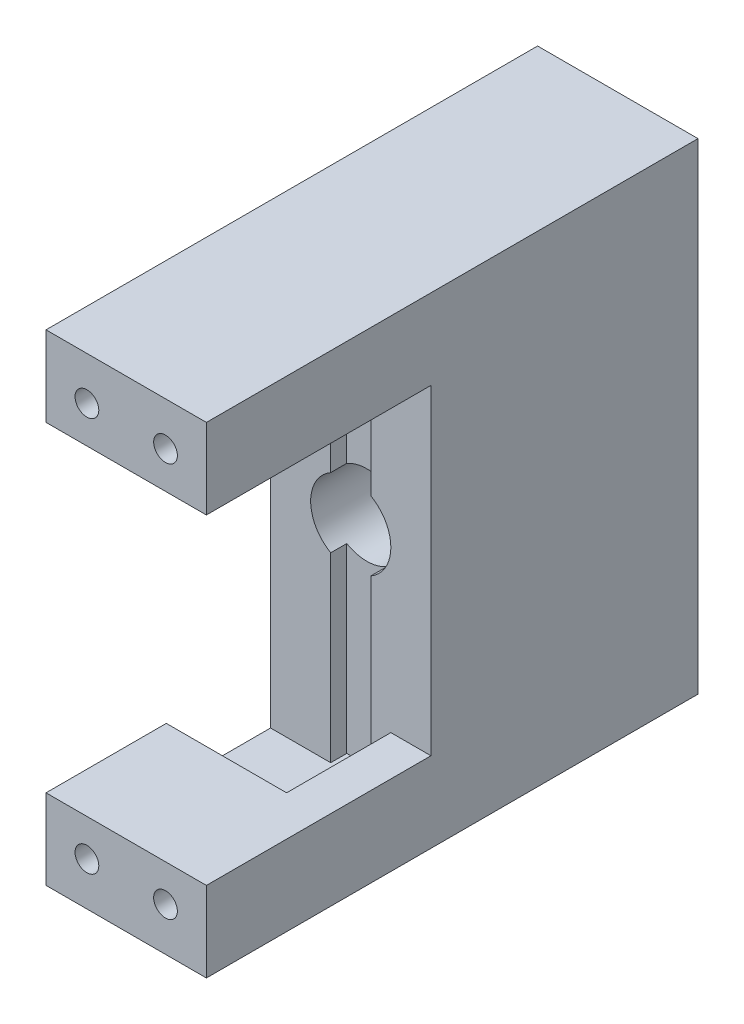
ISO-10303-21;
HEADER;
FILE_DESCRIPTION(('STEP AP214'),'2;1');
FILE_NAME('part.step','',(''),(''),'','','');
FILE_SCHEMA(('AUTOMOTIVE_DESIGN { 1 0 10303 214 1 1 1 1 }'));
ENDSEC;
DATA;
#1=APPLICATION_CONTEXT('core data for automotive mechanical design processes');
#2=APPLICATION_PROTOCOL_DEFINITION('international standard','automotive_design',2000,#1);
#3=PRODUCT_CONTEXT('',#1,'mechanical');
#4=PRODUCT('Part','Part','',(#3));
#5=PRODUCT_RELATED_PRODUCT_CATEGORY('part','',(#4));
#6=PRODUCT_DEFINITION_FORMATION('','',#4);
#7=PRODUCT_DEFINITION_CONTEXT('part definition',#1,'design');
#8=PRODUCT_DEFINITION('design','',#6,#7);
#9=PRODUCT_DEFINITION_SHAPE('','',#8);
#10=(LENGTH_UNIT() NAMED_UNIT(*) SI_UNIT(.MILLI.,.METRE.));
#11=(NAMED_UNIT(*) PLANE_ANGLE_UNIT() SI_UNIT($,.RADIAN.));
#12=(NAMED_UNIT(*) SI_UNIT($,.STERADIAN.) SOLID_ANGLE_UNIT());
#13=UNCERTAINTY_MEASURE_WITH_UNIT(LENGTH_MEASURE(1.E-05),#10,'distance_accuracy_value','');
#14=(GEOMETRIC_REPRESENTATION_CONTEXT(3) GLOBAL_UNCERTAINTY_ASSIGNED_CONTEXT((#13)) GLOBAL_UNIT_ASSIGNED_CONTEXT((#10,
#11,#12)) REPRESENTATION_CONTEXT('',''));
#15=CARTESIAN_POINT('',(0.,0.,0.));
#16=DIRECTION('',(0.,0.,1.));
#17=DIRECTION('',(1.,0.,0.));
#18=AXIS2_PLACEMENT_3D('',#15,#16,#17);
#19=CARTESIAN_POINT('',(0.,30.,0.));
#20=DIRECTION('',(0.,-1.,0.));
#21=DIRECTION('',(0.,0.,-1.));
#22=AXIS2_PLACEMENT_3D('',#19,#20,#21);
#23=PLANE('',#22);
#24=DIRECTION('',(-1.,0.,0.));
#25=VECTOR('',#24,1.);
#26=CARTESIAN_POINT('',(9.99999999999999,30.,-22.3));
#27=LINE('',#26,#25);
#28=CARTESIAN_POINT('',(9.99999999999999,30.,-22.3));
#29=VERTEX_POINT('',#28);
#30=CARTESIAN_POINT('',(-10.,30.,-22.3));
#31=VERTEX_POINT('',#30);
#32=EDGE_CURVE('E515',#29,#31,#27,.T.);
#33=ORIENTED_EDGE('',*,*,#32,.T.);
#34=DIRECTION('',(0.,0.,1.));
#35=VECTOR('',#34,1.);
#36=CARTESIAN_POINT('',(-10.,30.,14.));
#37=LINE('',#36,#35);
#38=CARTESIAN_POINT('',(-10.,30.,39.));
#39=VERTEX_POINT('',#38);
#40=EDGE_CURVE('E621',#31,#39,#37,.T.);
#41=ORIENTED_EDGE('',*,*,#40,.T.);
#42=DIRECTION('',(-1.,0.,0.));
#43=VECTOR('',#42,1.);
#44=CARTESIAN_POINT('',(-10.,30.,39.));
#45=LINE('',#44,#43);
#46=CARTESIAN_POINT('',(10.,30.,39.));
#47=VERTEX_POINT('',#46);
#48=EDGE_CURVE('E591',#47,#39,#45,.T.);
#49=ORIENTED_EDGE('',*,*,#48,.F.);
#50=DIRECTION('',(0.,0.,-1.));
#51=VECTOR('',#50,1.);
#52=CARTESIAN_POINT('',(9.99999999999999,30.,14.));
#53=LINE('',#52,#51);
#54=EDGE_CURVE('E623',#47,#29,#53,.T.);
#55=ORIENTED_EDGE('',*,*,#54,.T.);
#56=EDGE_LOOP('',(#33,#41,#49,#55));
#57=FACE_BOUND('',#56,.T.);
#58=ADVANCED_FACE('F151',(#57),#23,.F.);
#59=CARTESIAN_POINT('',(-10.,20.,32.));
#60=DIRECTION('',(0.,1.,0.));
#61=DIRECTION('',(0.,0.,1.));
#62=AXIS2_PLACEMENT_3D('',#59,#60,#61);
#63=PLANE('',#62);
#64=DIRECTION('',(-1.,0.,0.));
#65=VECTOR('',#64,1.);
#66=CARTESIAN_POINT('',(0.,20.,-22.3));
#67=LINE('',#66,#65);
#68=CARTESIAN_POINT('',(2.5,20.,-22.3));
#69=VERTEX_POINT('',#68);
#70=CARTESIAN_POINT('',(-2.5,20.,-22.3));
#71=VERTEX_POINT('',#70);
#72=EDGE_CURVE('E393',#69,#71,#67,.T.);
#73=ORIENTED_EDGE('',*,*,#72,.F.);
#74=DIRECTION('',(0.,0.,1.));
#75=VECTOR('',#74,1.);
#76=CARTESIAN_POINT('',(2.5,20.,9.));
#77=LINE('',#76,#75);
#78=CARTESIAN_POINT('',(2.5,20.,11.));
#79=VERTEX_POINT('',#78);
#80=EDGE_CURVE('E420',#69,#79,#77,.T.);
#81=ORIENTED_EDGE('',*,*,#80,.T.);
#82=DIRECTION('',(1.,0.,0.));
#83=VECTOR('',#82,1.);
#84=CARTESIAN_POINT('',(-10.,20.,11.));
#85=LINE('',#84,#83);
#86=CARTESIAN_POINT('',(9.99999999999999,20.,11.));
#87=VERTEX_POINT('',#86);
#88=EDGE_CURVE('E599',#79,#87,#85,.T.);
#89=ORIENTED_EDGE('',*,*,#88,.T.);
#90=DIRECTION('',(0.,0.,-1.));
#91=VECTOR('',#90,1.);
#92=CARTESIAN_POINT('',(9.99999999999999,20.,32.));
#93=LINE('',#92,#91);
#94=CARTESIAN_POINT('',(10.,20.,39.));
#95=VERTEX_POINT('',#94);
#96=EDGE_CURVE('E609',#95,#87,#93,.T.);
#97=ORIENTED_EDGE('',*,*,#96,.F.);
#98=DIRECTION('',(1.,0.,0.));
#99=VECTOR('',#98,1.);
#100=CARTESIAN_POINT('',(-10.,20.,39.));
#101=LINE('',#100,#99);
#102=CARTESIAN_POINT('',(-10.,20.,39.));
#103=VERTEX_POINT('',#102);
#104=EDGE_CURVE('E585',#103,#95,#101,.T.);
#105=ORIENTED_EDGE('',*,*,#104,.F.);
#106=DIRECTION('',(0.,0.,-1.));
#107=VECTOR('',#106,1.);
#108=CARTESIAN_POINT('',(-10.,20.,32.));
#109=LINE('',#108,#107);
#110=CARTESIAN_POINT('',(-10.,20.,11.));
#111=VERTEX_POINT('',#110);
#112=EDGE_CURVE('E612',#103,#111,#109,.T.);
#113=ORIENTED_EDGE('',*,*,#112,.T.);
#114=CARTESIAN_POINT('',(-2.5,20.,11.));
#115=VERTEX_POINT('',#114);
#116=EDGE_CURVE('E600',#111,#115,#85,.T.);
#117=ORIENTED_EDGE('',*,*,#116,.T.);
#118=DIRECTION('',(0.,0.,1.));
#119=VECTOR('',#118,1.);
#120=CARTESIAN_POINT('',(-2.5,20.,9.));
#121=LINE('',#120,#119);
#122=EDGE_CURVE('E432',#71,#115,#121,.T.);
#123=ORIENTED_EDGE('',*,*,#122,.F.);
#124=EDGE_LOOP('',(#73,#81,#89,#97,#105,#113,#117,#123));
#125=FACE_BOUND('',#124,.T.);
#126=ADVANCED_FACE('F653',(#125),#63,.F.);
#127=CARTESIAN_POINT('',(2.5,0.,9.));
#128=DIRECTION('',(-1.,0.,0.));
#129=DIRECTION('',(0.,0.,1.));
#130=AXIS2_PLACEMENT_3D('',#127,#128,#129);
#131=PLANE('',#130);
#132=DIRECTION('',(0.,0.,1.));
#133=VECTOR('',#132,1.);
#134=CARTESIAN_POINT('',(2.5,16.,7.));
#135=LINE('',#134,#133);
#136=CARTESIAN_POINT('',(2.5,16.,7.));
#137=VERTEX_POINT('',#136);
#138=CARTESIAN_POINT('',(2.5,16.,9.));
#139=VERTEX_POINT('',#138);
#140=EDGE_CURVE('E364',#137,#139,#135,.T.);
#141=ORIENTED_EDGE('',*,*,#140,.T.);
#142=DIRECTION('',(0.,-1.,0.));
#143=VECTOR('',#142,1.);
#144=CARTESIAN_POINT('',(2.5,0.,9.));
#145=LINE('',#144,#143);
#146=CARTESIAN_POINT('',(2.5,4.33012701892219,9.));
#147=VERTEX_POINT('',#146);
#148=EDGE_CURVE('E414',#139,#147,#145,.T.);
#149=ORIENTED_EDGE('',*,*,#148,.T.);
#150=DIRECTION('',(0.,0.,1.));
#151=VECTOR('',#150,1.);
#152=CARTESIAN_POINT('',(2.5,4.33012701892219,9.));
#153=LINE('',#152,#151);
#154=CARTESIAN_POINT('',(2.5,4.33012701892219,11.));
#155=VERTEX_POINT('',#154);
#156=EDGE_CURVE('E426',#147,#155,#153,.T.);
#157=ORIENTED_EDGE('',*,*,#156,.T.);
#158=DIRECTION('',(0.,-1.,0.));
#159=VECTOR('',#158,1.);
#160=CARTESIAN_POINT('',(2.5,0.,11.));
#161=LINE('',#160,#159);
#162=EDGE_CURVE('E421',#79,#155,#161,.T.);
#163=ORIENTED_EDGE('',*,*,#162,.F.);
#164=ORIENTED_EDGE('',*,*,#80,.F.);
#165=DIRECTION('',(0.,1.,0.));
#166=VECTOR('',#165,1.);
#167=CARTESIAN_POINT('',(2.5,0.,-22.3));
#168=LINE('',#167,#166);
#169=CARTESIAN_POINT('',(2.5,18.,-22.3));
#170=VERTEX_POINT('',#169);
#171=EDGE_CURVE('E391',#170,#69,#168,.T.);
#172=ORIENTED_EDGE('',*,*,#171,.F.);
#173=DIRECTION('',(0.,0.,1.));
#174=VECTOR('',#173,1.);
#175=CARTESIAN_POINT('',(2.5,18.,-41.));
#176=LINE('',#175,#174);
#177=CARTESIAN_POINT('',(2.5,18.,6.99999999999999));
#178=VERTEX_POINT('',#177);
#179=EDGE_CURVE('E368',#170,#178,#176,.T.);
#180=ORIENTED_EDGE('',*,*,#179,.T.);
#181=DIRECTION('',(0.,-1.,0.));
#182=VECTOR('',#181,1.);
#183=CARTESIAN_POINT('',(2.5,18.,7.));
#184=LINE('',#183,#182);
#185=EDGE_CURVE('E167',#178,#137,#184,.T.);
#186=ORIENTED_EDGE('',*,*,#185,.T.);
#187=EDGE_LOOP('',(#141,#149,#157,#163,#164,#172,#180,#186));
#188=FACE_BOUND('',#187,.T.);
#189=ADVANCED_FACE('F363',(#188),#131,.T.);
#190=CARTESIAN_POINT('',(-2.5,0.,9.));
#191=DIRECTION('',(-1.,0.,0.));
#192=DIRECTION('',(0.,0.,1.));
#193=AXIS2_PLACEMENT_3D('',#190,#191,#192);
#194=PLANE('',#193);
#195=DIRECTION('',(0.,-1.,0.));
#196=VECTOR('',#195,1.);
#197=CARTESIAN_POINT('',(-2.5,0.,9.));
#198=LINE('',#197,#196);
#199=CARTESIAN_POINT('',(-2.5,16.,9.));
#200=VERTEX_POINT('',#199);
#201=CARTESIAN_POINT('',(-2.5,4.3301270189222,8.99999999999999));
#202=VERTEX_POINT('',#201);
#203=EDGE_CURVE('E175',#200,#202,#198,.T.);
#204=ORIENTED_EDGE('',*,*,#203,.F.);
#205=DIRECTION('',(0.,0.,1.));
#206=VECTOR('',#205,1.);
#207=CARTESIAN_POINT('',(-2.5,16.,7.));
#208=LINE('',#207,#206);
#209=CARTESIAN_POINT('',(-2.5,16.,7.));
#210=VERTEX_POINT('',#209);
#211=EDGE_CURVE('E378',#210,#200,#208,.T.);
#212=ORIENTED_EDGE('',*,*,#211,.F.);
#213=DIRECTION('',(0.,-1.,0.));
#214=VECTOR('',#213,1.);
#215=CARTESIAN_POINT('',(-2.5,18.,7.));
#216=LINE('',#215,#214);
#217=CARTESIAN_POINT('',(-2.5,18.,7.));
#218=VERTEX_POINT('',#217);
#219=EDGE_CURVE('E379',#218,#210,#216,.T.);
#220=ORIENTED_EDGE('',*,*,#219,.F.);
#221=DIRECTION('',(0.,0.,1.));
#222=VECTOR('',#221,1.);
#223=CARTESIAN_POINT('',(-2.5,18.,-41.));
#224=LINE('',#223,#222);
#225=CARTESIAN_POINT('',(-2.5,18.,-22.3));
#226=VERTEX_POINT('',#225);
#227=EDGE_CURVE('E405',#226,#218,#224,.T.);
#228=ORIENTED_EDGE('',*,*,#227,.F.);
#229=DIRECTION('',(0.,-1.,0.));
#230=VECTOR('',#229,1.);
#231=CARTESIAN_POINT('',(-2.49999999999999,0.,-22.3));
#232=LINE('',#231,#230);
#233=EDGE_CURVE('E395',#71,#226,#232,.T.);
#234=ORIENTED_EDGE('',*,*,#233,.F.);
#235=ORIENTED_EDGE('',*,*,#122,.T.);
#236=DIRECTION('',(0.,-1.,0.));
#237=VECTOR('',#236,1.);
#238=CARTESIAN_POINT('',(-2.5,0.,11.));
#239=LINE('',#238,#237);
#240=CARTESIAN_POINT('',(-2.5,4.3301270189222,11.));
#241=VERTEX_POINT('',#240);
#242=EDGE_CURVE('E416',#115,#241,#239,.T.);
#243=ORIENTED_EDGE('',*,*,#242,.T.);
#244=DIRECTION('',(0.,0.,1.));
#245=VECTOR('',#244,1.);
#246=CARTESIAN_POINT('',(-2.5,4.3301270189222,9.));
#247=LINE('',#246,#245);
#248=EDGE_CURVE('E429',#202,#241,#247,.T.);
#249=ORIENTED_EDGE('',*,*,#248,.F.);
#250=EDGE_LOOP('',(#204,#212,#220,#228,#234,#235,#243,#249));
#251=FACE_BOUND('',#250,.T.);
#252=ADVANCED_FACE('F767',(#251),#194,.F.);
#253=CARTESIAN_POINT('',(0.,0.,11.));
#254=DIRECTION('',(0.,0.,-1.));
#255=DIRECTION('',(-1.,0.,0.));
#256=AXIS2_PLACEMENT_3D('',#253,#254,#255);
#257=PLANE('',#256);
#258=ORIENTED_EDGE('',*,*,#162,.T.);
#259=CARTESIAN_POINT('',(0.,0.,11.));
#260=DIRECTION('',(0.,0.,1.));
#261=DIRECTION('',(1.,0.,0.));
#262=AXIS2_PLACEMENT_3D('',#259,#260,#261);
#263=CIRCLE('',#262,5.);
#264=CARTESIAN_POINT('',(2.5,-4.33012701892219,11.));
#265=VERTEX_POINT('',#264);
#266=EDGE_CURVE('E476',#265,#155,#263,.T.);
#267=ORIENTED_EDGE('',*,*,#266,.F.);
#268=DIRECTION('',(0.,-1.,0.));
#269=VECTOR('',#268,1.);
#270=CARTESIAN_POINT('',(2.5,0.,11.));
#271=LINE('',#270,#269);
#272=CARTESIAN_POINT('',(2.5,-27.,11.));
#273=VERTEX_POINT('',#272);
#274=EDGE_CURVE('E413',#265,#273,#271,.T.);
#275=ORIENTED_EDGE('',*,*,#274,.T.);
#276=DIRECTION('',(1.,0.,0.));
#277=VECTOR('',#276,1.);
#278=CARTESIAN_POINT('',(0.,-27.,11.));
#279=LINE('',#278,#277);
#280=CARTESIAN_POINT('',(5.,-27.,11.));
#281=VERTEX_POINT('',#280);
#282=EDGE_CURVE('E526',#273,#281,#279,.T.);
#283=ORIENTED_EDGE('',*,*,#282,.T.);
#284=DIRECTION('',(0.,1.,0.));
#285=VECTOR('',#284,1.);
#286=CARTESIAN_POINT('',(5.,-27.0024273078207,11.));
#287=LINE('',#286,#285);
#288=CARTESIAN_POINT('',(5.,-20.,11.));
#289=VERTEX_POINT('',#288);
#290=EDGE_CURVE('E521',#281,#289,#287,.T.);
#291=ORIENTED_EDGE('',*,*,#290,.T.);
#292=DIRECTION('',(1.,0.,0.));
#293=VECTOR('',#292,1.);
#294=CARTESIAN_POINT('',(-10.,-20.,11.));
#295=LINE('',#294,#293);
#296=CARTESIAN_POINT('',(10.,-20.,11.));
#297=VERTEX_POINT('',#296);
#298=EDGE_CURVE('E594',#289,#297,#295,.T.);
#299=ORIENTED_EDGE('',*,*,#298,.T.);
#300=DIRECTION('',(0.,-1.,0.));
#301=VECTOR('',#300,1.);
#302=CARTESIAN_POINT('',(10.,20.,11.));
#303=LINE('',#302,#301);
#304=EDGE_CURVE('E596',#87,#297,#303,.T.);
#305=ORIENTED_EDGE('',*,*,#304,.F.);
#306=ORIENTED_EDGE('',*,*,#88,.F.);
#307=EDGE_LOOP('',(#258,#267,#275,#283,#291,#299,#305,#306));
#308=FACE_BOUND('',#307,.T.);
#309=ADVANCED_FACE('F740',(#308),#257,.F.);
#310=CARTESIAN_POINT('',(-2.5,-4.3301270189222,11.));
#311=VERTEX_POINT('',#310);
#312=EDGE_CURVE('E487',#241,#311,#263,.T.);
#313=ORIENTED_EDGE('',*,*,#312,.F.);
#314=ORIENTED_EDGE('',*,*,#242,.F.);
#315=ORIENTED_EDGE('',*,*,#116,.F.);
#316=DIRECTION('',(0.,-1.,0.));
#317=VECTOR('',#316,1.);
#318=CARTESIAN_POINT('',(-10.,20.,11.));
#319=LINE('',#318,#317);
#320=CARTESIAN_POINT('',(-10.,-27.,11.));
#321=VERTEX_POINT('',#320);
#322=EDGE_CURVE('E603',#111,#321,#319,.T.);
#323=ORIENTED_EDGE('',*,*,#322,.T.);
#324=CARTESIAN_POINT('',(-2.5,-27.,11.));
#325=VERTEX_POINT('',#324);
#326=EDGE_CURVE('E527',#321,#325,#279,.T.);
#327=ORIENTED_EDGE('',*,*,#326,.T.);
#328=DIRECTION('',(0.,-1.,0.));
#329=VECTOR('',#328,1.);
#330=CARTESIAN_POINT('',(-2.5,0.,11.));
#331=LINE('',#330,#329);
#332=EDGE_CURVE('E438',#311,#325,#331,.T.);
#333=ORIENTED_EDGE('',*,*,#332,.F.);
#334=EDGE_LOOP('',(#313,#314,#315,#323,#327,#333));
#335=FACE_BOUND('',#334,.T.);
#336=ADVANCED_FACE('F705',(#335),#257,.F.);
#337=CARTESIAN_POINT('',(0.,0.,-19.3));
#338=DIRECTION('',(0.,0.,1.));
#339=DIRECTION('',(1.,0.,0.));
#340=AXIS2_PLACEMENT_3D('',#337,#338,#339);
#341=CYLINDRICAL_SURFACE('',#340,5.);
#342=CARTESIAN_POINT('',(0.,0.,-19.3));
#343=DIRECTION('',(0.,0.,1.));
#344=DIRECTION('',(1.,0.,0.));
#345=AXIS2_PLACEMENT_3D('',#342,#343,#344);
#346=CIRCLE('',#345,5.);
#347=CARTESIAN_POINT('',(5.,0.,-19.3));
#348=VERTEX_POINT('',#347);
#349=EDGE_CURVE('E484',#348,#348,#346,.T.);
#350=ORIENTED_EDGE('',*,*,#349,.F.);
#351=EDGE_LOOP('',(#350));
#352=FACE_BOUND('',#351,.T.);
#353=ORIENTED_EDGE('',*,*,#156,.F.);
#354=CARTESIAN_POINT('',(0.,0.,9.));
#355=DIRECTION('',(0.,0.,1.));
#356=DIRECTION('',(1.,0.,0.));
#357=AXIS2_PLACEMENT_3D('',#354,#355,#356);
#358=CIRCLE('',#357,5.);
#359=EDGE_CURVE('E418',#202,#147,#358,.F.);
#360=ORIENTED_EDGE('',*,*,#359,.F.);
#361=ORIENTED_EDGE('',*,*,#248,.T.);
#362=ORIENTED_EDGE('',*,*,#312,.T.);
#363=DIRECTION('',(0.,0.,1.));
#364=VECTOR('',#363,1.);
#365=CARTESIAN_POINT('',(-2.5,-4.3301270189222,9.));
#366=LINE('',#365,#364);
#367=CARTESIAN_POINT('',(-2.5,-4.3301270189222,9.));
#368=VERTEX_POINT('',#367);
#369=EDGE_CURVE('E455',#368,#311,#366,.T.);
#370=ORIENTED_EDGE('',*,*,#369,.F.);
#371=CARTESIAN_POINT('',(0.,0.,9.));
#372=DIRECTION('',(0.,0.,1.));
#373=DIRECTION('',(1.,0.,0.));
#374=AXIS2_PLACEMENT_3D('',#371,#372,#373);
#375=CIRCLE('',#374,5.);
#376=CARTESIAN_POINT('',(2.5,-4.33012701892219,8.99999999999999));
#377=VERTEX_POINT('',#376);
#378=EDGE_CURVE('E437',#377,#368,#375,.F.);
#379=ORIENTED_EDGE('',*,*,#378,.F.);
#380=DIRECTION('',(0.,0.,1.));
#381=VECTOR('',#380,1.);
#382=CARTESIAN_POINT('',(2.5,-4.33012701892219,9.));
#383=LINE('',#382,#381);
#384=EDGE_CURVE('E447',#377,#265,#383,.T.);
#385=ORIENTED_EDGE('',*,*,#384,.T.);
#386=ORIENTED_EDGE('',*,*,#266,.T.);
#387=EDGE_LOOP('',(#353,#360,#361,#362,#370,#379,#385,#386));
#388=FACE_BOUND('',#387,.T.);
#389=ADVANCED_FACE('F772',(#352,#388),#341,.F.);
#390=CARTESIAN_POINT('',(0.,0.,-39.));
#391=DIRECTION('',(0.,0.,1.));
#392=DIRECTION('',(1.,0.,0.));
#393=AXIS2_PLACEMENT_3D('',#390,#391,#392);
#394=CYLINDRICAL_SURFACE('',#393,2.6);
#395=CARTESIAN_POINT('',(0.,0.,-19.3));
#396=DIRECTION('',(0.,0.,1.));
#397=DIRECTION('',(1.,0.,0.));
#398=AXIS2_PLACEMENT_3D('',#395,#396,#397);
#399=CIRCLE('',#398,2.6);
#400=CARTESIAN_POINT('',(2.6,0.,-19.3));
#401=VERTEX_POINT('',#400);
#402=EDGE_CURVE('E155',#401,#401,#399,.F.);
#403=ORIENTED_EDGE('',*,*,#402,.F.);
#404=EDGE_LOOP('',(#403));
#405=FACE_BOUND('',#404,.T.);
#406=CARTESIAN_POINT('',(0.,0.,-22.3));
#407=DIRECTION('',(0.,0.,-1.));
#408=DIRECTION('',(0.,1.,0.));
#409=AXIS2_PLACEMENT_3D('',#406,#407,#408);
#410=CIRCLE('',#409,2.6);
#411=CARTESIAN_POINT('',(0.,2.6,-22.3));
#412=VERTEX_POINT('',#411);
#413=EDGE_CURVE('E466',#412,#412,#410,.F.);
#414=ORIENTED_EDGE('',*,*,#413,.F.);
#415=EDGE_LOOP('',(#414));
#416=FACE_BOUND('',#415,.T.);
#417=ADVANCED_FACE('F809',(#405,#416),#394,.F.);
#418=CARTESIAN_POINT('',(3.05,0.,-26.3));
#419=DIRECTION('',(-1.,0.,0.));
#420=DIRECTION('',(0.,0.,1.));
#421=AXIS2_PLACEMENT_3D('',#418,#419,#420);
#422=PLANE('',#421);
#423=DIRECTION('',(0.,-1.,0.));
#424=VECTOR('',#423,1.);
#425=CARTESIAN_POINT('',(3.05,0.,-26.3));
#426=LINE('',#425,#424);
#427=CARTESIAN_POINT('',(3.05,18.,-26.3));
#428=VERTEX_POINT('',#427);
#429=CARTESIAN_POINT('',(3.05,3.05,-26.3));
#430=VERTEX_POINT('',#429);
#431=EDGE_CURVE('E490',#428,#430,#426,.T.);
#432=ORIENTED_EDGE('',*,*,#431,.F.);
#433=DIRECTION('',(0.,0.,-1.));
#434=VECTOR('',#433,1.);
#435=CARTESIAN_POINT('',(3.05,18.,-22.3));
#436=LINE('',#435,#434);
#437=CARTESIAN_POINT('',(3.05,18.,-22.3));
#438=VERTEX_POINT('',#437);
#439=EDGE_CURVE('E401',#438,#428,#436,.T.);
#440=ORIENTED_EDGE('',*,*,#439,.F.);
#441=DIRECTION('',(0.,-1.,0.));
#442=VECTOR('',#441,1.);
#443=CARTESIAN_POINT('',(3.05,0.,-22.3));
#444=LINE('',#443,#442);
#445=CARTESIAN_POINT('',(3.05,3.05,-22.3));
#446=VERTEX_POINT('',#445);
#447=EDGE_CURVE('E500',#438,#446,#444,.T.);
#448=ORIENTED_EDGE('',*,*,#447,.T.);
#449=DIRECTION('',(0.,0.,-1.));
#450=VECTOR('',#449,1.);
#451=CARTESIAN_POINT('',(3.05,3.05,-22.3));
#452=LINE('',#451,#450);
#453=EDGE_CURVE('E469',#446,#430,#452,.T.);
#454=ORIENTED_EDGE('',*,*,#453,.T.);
#455=EDGE_LOOP('',(#432,#440,#448,#454));
#456=FACE_BOUND('',#455,.T.);
#457=ADVANCED_FACE('F813',(#456),#422,.F.);
#458=CARTESIAN_POINT('',(-3.05,0.,-26.3));
#459=DIRECTION('',(-1.,0.,0.));
#460=DIRECTION('',(0.,0.,1.));
#461=AXIS2_PLACEMENT_3D('',#458,#459,#460);
#462=PLANE('',#461);
#463=DIRECTION('',(0.,0.,-1.));
#464=VECTOR('',#463,1.);
#465=CARTESIAN_POINT('',(-3.05,18.,-22.3));
#466=LINE('',#465,#464);
#467=CARTESIAN_POINT('',(-3.05,18.,-22.3));
#468=VERTEX_POINT('',#467);
#469=CARTESIAN_POINT('',(-3.05,18.,-26.3));
#470=VERTEX_POINT('',#469);
#471=EDGE_CURVE('E402',#468,#470,#466,.T.);
#472=ORIENTED_EDGE('',*,*,#471,.T.);
#473=DIRECTION('',(0.,-1.,0.));
#474=VECTOR('',#473,1.);
#475=CARTESIAN_POINT('',(-3.05,0.,-26.3));
#476=LINE('',#475,#474);
#477=CARTESIAN_POINT('',(-3.05,3.05,-26.3));
#478=VERTEX_POINT('',#477);
#479=EDGE_CURVE('E497',#470,#478,#476,.T.);
#480=ORIENTED_EDGE('',*,*,#479,.T.);
#481=DIRECTION('',(0.,0.,-1.));
#482=VECTOR('',#481,1.);
#483=CARTESIAN_POINT('',(-3.05,3.05,-22.3));
#484=LINE('',#483,#482);
#485=CARTESIAN_POINT('',(-3.05,3.05,-22.3));
#486=VERTEX_POINT('',#485);
#487=EDGE_CURVE('E473',#486,#478,#484,.T.);
#488=ORIENTED_EDGE('',*,*,#487,.F.);
#489=DIRECTION('',(0.,-1.,0.));
#490=VECTOR('',#489,1.);
#491=CARTESIAN_POINT('',(-3.05,0.,-22.3));
#492=LINE('',#491,#490);
#493=EDGE_CURVE('E504',#468,#486,#492,.T.);
#494=ORIENTED_EDGE('',*,*,#493,.F.);
#495=EDGE_LOOP('',(#472,#480,#488,#494));
#496=FACE_BOUND('',#495,.T.);
#497=ADVANCED_FACE('F818',(#496),#462,.T.);
#498=CARTESIAN_POINT('',(0.,0.,-26.3));
#499=DIRECTION('',(0.,0.,-1.));
#500=DIRECTION('',(0.,1.,0.));
#501=AXIS2_PLACEMENT_3D('',#498,#499,#500);
#502=PLANE('',#501);
#503=ORIENTED_EDGE('',*,*,#479,.F.);
#504=DIRECTION('',(-1.,0.,0.));
#505=VECTOR('',#504,1.);
#506=CARTESIAN_POINT('',(0.,18.,-26.3));
#507=LINE('',#506,#505);
#508=EDGE_CURVE('E409',#428,#470,#507,.T.);
#509=ORIENTED_EDGE('',*,*,#508,.F.);
#510=ORIENTED_EDGE('',*,*,#431,.T.);
#511=DIRECTION('',(-1.,0.,0.));
#512=VECTOR('',#511,1.);
#513=CARTESIAN_POINT('',(0.,3.05,-26.3));
#514=LINE('',#513,#512);
#515=EDGE_CURVE('E428',#430,#478,#514,.T.);
#516=ORIENTED_EDGE('',*,*,#515,.T.);
#517=EDGE_LOOP('',(#503,#509,#510,#516));
#518=FACE_BOUND('',#517,.T.);
#519=ADVANCED_FACE('F676',(#518),#502,.T.);
#520=CARTESIAN_POINT('',(0.,-27.,0.));
#521=DIRECTION('',(0.,1.,0.));
#522=DIRECTION('',(0.,0.,1.));
#523=AXIS2_PLACEMENT_3D('',#520,#521,#522);
#524=PLANE('',#523);
#525=DIRECTION('',(0.,0.,-1.));
#526=VECTOR('',#525,1.);
#527=CARTESIAN_POINT('',(5.,-27.,0.));
#528=LINE('',#527,#526);
#529=CARTESIAN_POINT('',(5.,-27.,24.));
#530=VERTEX_POINT('',#529);
#531=EDGE_CURVE('E539',#530,#281,#528,.T.);
#532=ORIENTED_EDGE('',*,*,#531,.T.);
#533=ORIENTED_EDGE('',*,*,#282,.F.);
#534=DIRECTION('',(0.,0.,1.));
#535=VECTOR('',#534,1.);
#536=CARTESIAN_POINT('',(2.5,-27.,9.));
#537=LINE('',#536,#535);
#538=CARTESIAN_POINT('',(2.5,-27.,9.));
#539=VERTEX_POINT('',#538);
#540=EDGE_CURVE('E424',#539,#273,#537,.T.);
#541=ORIENTED_EDGE('',*,*,#540,.F.);
#542=DIRECTION('',(1.,0.,0.));
#543=VECTOR('',#542,1.);
#544=CARTESIAN_POINT('',(0.,-27.,9.));
#545=LINE('',#544,#543);
#546=CARTESIAN_POINT('',(-2.5,-27.,9.));
#547=VERTEX_POINT('',#546);
#548=EDGE_CURVE('E444',#547,#539,#545,.T.);
#549=ORIENTED_EDGE('',*,*,#548,.F.);
#550=DIRECTION('',(0.,0.,1.));
#551=VECTOR('',#550,1.);
#552=CARTESIAN_POINT('',(-2.5,-27.,9.));
#553=LINE('',#552,#551);
#554=EDGE_CURVE('E453',#547,#325,#553,.T.);
#555=ORIENTED_EDGE('',*,*,#554,.T.);
#556=ORIENTED_EDGE('',*,*,#326,.F.);
#557=DIRECTION('',(0.,0.,-1.));
#558=VECTOR('',#557,1.);
#559=CARTESIAN_POINT('',(-10.,-27.,0.));
#560=LINE('',#559,#558);
#561=CARTESIAN_POINT('',(-10.,-27.,24.));
#562=VERTEX_POINT('',#561);
#563=EDGE_CURVE('E535',#562,#321,#560,.T.);
#564=ORIENTED_EDGE('',*,*,#563,.F.);
#565=DIRECTION('',(-1.,0.,0.));
#566=VECTOR('',#565,1.);
#567=CARTESIAN_POINT('',(5.,-27.,24.));
#568=LINE('',#567,#566);
#569=EDGE_CURVE('E546',#530,#562,#568,.T.);
#570=ORIENTED_EDGE('',*,*,#569,.F.);
#571=EDGE_LOOP('',(#532,#533,#541,#549,#555,#556,#564,#570));
#572=FACE_BOUND('',#571,.T.);
#573=ADVANCED_FACE('F669',(#572),#524,.T.);
#574=CARTESIAN_POINT('',(-10.,28.,4.));
#575=DIRECTION('',(1.,0.,0.));
#576=DIRECTION('',(0.,1.,0.));
#577=AXIS2_PLACEMENT_3D('',#574,#575,#576);
#578=PLANE('',#577);
#579=DIRECTION('',(0.,0.,1.));
#580=VECTOR('',#579,1.);
#581=CARTESIAN_POINT('',(-10.,-30.,4.));
#582=LINE('',#581,#580);
#583=CARTESIAN_POINT('',(-10.,-30.,-22.3));
#584=VERTEX_POINT('',#583);
#585=CARTESIAN_POINT('',(-10.,-30.,39.));
#586=VERTEX_POINT('',#585);
#587=EDGE_CURVE('E625',#584,#586,#582,.T.);
#588=ORIENTED_EDGE('',*,*,#587,.T.);
#589=DIRECTION('',(0.,-1.,0.));
#590=VECTOR('',#589,1.);
#591=CARTESIAN_POINT('',(-10.,-20.,39.));
#592=LINE('',#591,#590);
#593=CARTESIAN_POINT('',(-10.,-20.,39.));
#594=VERTEX_POINT('',#593);
#595=EDGE_CURVE('E564',#594,#586,#592,.T.);
#596=ORIENTED_EDGE('',*,*,#595,.F.);
#597=DIRECTION('',(0.,0.,-1.));
#598=VECTOR('',#597,1.);
#599=CARTESIAN_POINT('',(-10.,-20.,32.));
#600=LINE('',#599,#598);
#601=CARTESIAN_POINT('',(-10.,-20.,24.));
#602=VERTEX_POINT('',#601);
#603=EDGE_CURVE('E618',#594,#602,#600,.T.);
#604=ORIENTED_EDGE('',*,*,#603,.T.);
#605=DIRECTION('',(0.,-1.,0.));
#606=VECTOR('',#605,1.);
#607=CARTESIAN_POINT('',(-10.,0.,24.));
#608=LINE('',#607,#606);
#609=EDGE_CURVE('E540',#602,#562,#608,.T.);
#610=ORIENTED_EDGE('',*,*,#609,.T.);
#611=ORIENTED_EDGE('',*,*,#563,.T.);
#612=ORIENTED_EDGE('',*,*,#322,.F.);
#613=ORIENTED_EDGE('',*,*,#112,.F.);
#614=DIRECTION('',(0.,-1.,0.));
#615=VECTOR('',#614,1.);
#616=CARTESIAN_POINT('',(-10.,30.,39.));
#617=LINE('',#616,#615);
#618=EDGE_CURVE('E582',#39,#103,#617,.T.);
#619=ORIENTED_EDGE('',*,*,#618,.F.);
#620=ORIENTED_EDGE('',*,*,#40,.F.);
#621=DIRECTION('',(0.,-1.,0.));
#622=VECTOR('',#621,1.);
#623=CARTESIAN_POINT('',(-10.,0.,-22.3));
#624=LINE('',#623,#622);
#625=EDGE_CURVE('E511',#31,#584,#624,.T.);
#626=ORIENTED_EDGE('',*,*,#625,.T.);
#627=EDGE_LOOP('',(#588,#596,#604,#610,#611,#612,#613,#619,#620,#626));
#628=FACE_BOUND('',#627,.T.);
#629=ADVANCED_FACE('F666',(#628),#578,.F.);
#630=CARTESIAN_POINT('',(4.9,-24.6,12.));
#631=DIRECTION('',(0.,0.,1.));
#632=DIRECTION('',(1.,0.,0.));
#633=AXIS2_PLACEMENT_3D('',#630,#631,#632);
#634=CYLINDRICAL_SURFACE('',#633,1.48);
#635=CARTESIAN_POINT('',(4.9,-24.6,39.));
#636=DIRECTION('',(0.,0.,1.));
#637=DIRECTION('',(1.,0.,0.));
#638=AXIS2_PLACEMENT_3D('',#635,#636,#637);
#639=CIRCLE('',#638,1.48);
#640=CARTESIAN_POINT('',(6.38,-24.6,39.));
#641=VERTEX_POINT('',#640);
#642=EDGE_CURVE('E558',#641,#641,#639,.T.);
#643=ORIENTED_EDGE('',*,*,#642,.T.);
#644=EDGE_LOOP('',(#643));
#645=FACE_BOUND('',#644,.T.);
#646=CARTESIAN_POINT('',(4.9,-24.6,24.));
#647=DIRECTION('',(0.,0.,-1.));
#648=DIRECTION('',(-1.,0.,0.));
#649=AXIS2_PLACEMENT_3D('',#646,#647,#648);
#650=CIRCLE('',#649,1.48);
#651=CARTESIAN_POINT('',(5.,-23.1233822430974,24.));
#652=VERTEX_POINT('',#651);
#653=CARTESIAN_POINT('',(5.,-26.0766177569026,24.));
#654=VERTEX_POINT('',#653);
#655=EDGE_CURVE('E533',#652,#654,#650,.T.);
#656=ORIENTED_EDGE('',*,*,#655,.T.);
#657=CARTESIAN_POINT('',(4.9,-24.6,24.));
#658=DIRECTION('',(0.,0.,-1.));
#659=DIRECTION('',(-1.,0.,0.));
#660=AXIS2_PLACEMENT_3D('',#657,#658,#659);
#661=CIRCLE('',#660,1.48);
#662=EDGE_CURVE('E12',#652,#654,#661,.F.);
#663=ORIENTED_EDGE('',*,*,#662,.F.);
#664=EDGE_LOOP('',(#656,#663));
#665=FACE_BOUND('',#664,.T.);
#666=ADVANCED_FACE('F668',(#645,#665),#634,.F.);
#667=CARTESIAN_POINT('',(0.,-20.,32.));
#668=DIRECTION('',(0.,1.,0.));
#669=DIRECTION('',(0.,0.,1.));
#670=AXIS2_PLACEMENT_3D('',#667,#668,#669);
#671=PLANE('',#670);
#672=DIRECTION('',(0.,0.,-1.));
#673=VECTOR('',#672,1.);
#674=CARTESIAN_POINT('',(5.,-20.,0.));
#675=LINE('',#674,#673);
#676=CARTESIAN_POINT('',(5.,-20.,24.));
#677=VERTEX_POINT('',#676);
#678=EDGE_CURVE('E536',#677,#289,#675,.T.);
#679=ORIENTED_EDGE('',*,*,#678,.F.);
#680=DIRECTION('',(-1.,0.,0.));
#681=VECTOR('',#680,1.);
#682=CARTESIAN_POINT('',(5.,-20.,24.));
#683=LINE('',#682,#681);
#684=EDGE_CURVE('E551',#677,#602,#683,.T.);
#685=ORIENTED_EDGE('',*,*,#684,.T.);
#686=ORIENTED_EDGE('',*,*,#603,.F.);
#687=DIRECTION('',(-1.,0.,0.));
#688=VECTOR('',#687,1.);
#689=CARTESIAN_POINT('',(-10.,-20.,39.));
#690=LINE('',#689,#688);
#691=CARTESIAN_POINT('',(10.,-20.,39.));
#692=VERTEX_POINT('',#691);
#693=EDGE_CURVE('E573',#692,#594,#690,.T.);
#694=ORIENTED_EDGE('',*,*,#693,.F.);
#695=DIRECTION('',(0.,0.,-1.));
#696=VECTOR('',#695,1.);
#697=CARTESIAN_POINT('',(10.,-20.,32.));
#698=LINE('',#697,#696);
#699=EDGE_CURVE('E615',#692,#297,#698,.T.);
#700=ORIENTED_EDGE('',*,*,#699,.T.);
#701=ORIENTED_EDGE('',*,*,#298,.F.);
#702=EDGE_LOOP('',(#679,#685,#686,#694,#700,#701));
#703=FACE_BOUND('',#702,.T.);
#704=ADVANCED_FACE('F663',(#703),#671,.T.);
#705=CARTESIAN_POINT('',(-4.9,-24.6,12.));
#706=DIRECTION('',(0.,0.,1.));
#707=DIRECTION('',(1.,0.,0.));
#708=AXIS2_PLACEMENT_3D('',#705,#706,#707);
#709=CYLINDRICAL_SURFACE('',#708,1.48);
#710=CARTESIAN_POINT('',(-4.9,-24.6,39.));
#711=DIRECTION('',(0.,0.,1.));
#712=DIRECTION('',(1.,0.,0.));
#713=AXIS2_PLACEMENT_3D('',#710,#711,#712);
#714=CIRCLE('',#713,1.48);
#715=CARTESIAN_POINT('',(-3.42,-24.6,39.));
#716=VERTEX_POINT('',#715);
#717=EDGE_CURVE('E561',#716,#716,#714,.T.);
#718=ORIENTED_EDGE('',*,*,#717,.T.);
#719=EDGE_LOOP('',(#718));
#720=FACE_BOUND('',#719,.T.);
#721=CARTESIAN_POINT('',(-4.9,-24.6,24.));
#722=DIRECTION('',(0.,0.,-1.));
#723=DIRECTION('',(-1.,0.,0.));
#724=AXIS2_PLACEMENT_3D('',#721,#722,#723);
#725=CIRCLE('',#724,1.48);
#726=CARTESIAN_POINT('',(-6.38,-24.6,24.));
#727=VERTEX_POINT('',#726);
#728=EDGE_CURVE('E554',#727,#727,#725,.F.);
#729=ORIENTED_EDGE('',*,*,#728,.F.);
#730=EDGE_LOOP('',(#729));
#731=FACE_BOUND('',#730,.T.);
#732=ADVANCED_FACE('F1038',(#720,#731),#709,.F.);
#733=CARTESIAN_POINT('',(9.99999999999999,28.,4.));
#734=DIRECTION('',(1.,0.,0.));
#735=DIRECTION('',(0.,1.,0.));
#736=AXIS2_PLACEMENT_3D('',#733,#734,#735);
#737=PLANE('',#736);
#738=ORIENTED_EDGE('',*,*,#304,.T.);
#739=ORIENTED_EDGE('',*,*,#699,.F.);
#740=DIRECTION('',(0.,1.,0.));
#741=VECTOR('',#740,1.);
#742=CARTESIAN_POINT('',(10.,-20.,39.));
#743=LINE('',#742,#741);
#744=CARTESIAN_POINT('',(10.,-30.,39.));
#745=VERTEX_POINT('',#744);
#746=EDGE_CURVE('E570',#745,#692,#743,.T.);
#747=ORIENTED_EDGE('',*,*,#746,.F.);
#748=DIRECTION('',(0.,0.,-1.));
#749=VECTOR('',#748,1.);
#750=CARTESIAN_POINT('',(10.,-30.,14.));
#751=LINE('',#750,#749);
#752=CARTESIAN_POINT('',(10.,-30.,-22.3));
#753=VERTEX_POINT('',#752);
#754=EDGE_CURVE('E160',#745,#753,#751,.T.);
#755=ORIENTED_EDGE('',*,*,#754,.T.);
#756=DIRECTION('',(0.,-1.,0.));
#757=VECTOR('',#756,1.);
#758=CARTESIAN_POINT('',(10.,0.,-22.3));
#759=LINE('',#758,#757);
#760=EDGE_CURVE('E512',#29,#753,#759,.T.);
#761=ORIENTED_EDGE('',*,*,#760,.F.);
#762=ORIENTED_EDGE('',*,*,#54,.F.);
#763=DIRECTION('',(0.,1.,0.));
#764=VECTOR('',#763,1.);
#765=CARTESIAN_POINT('',(10.,30.,39.));
#766=LINE('',#765,#764);
#767=EDGE_CURVE('E588',#95,#47,#766,.T.);
#768=ORIENTED_EDGE('',*,*,#767,.F.);
#769=ORIENTED_EDGE('',*,*,#96,.T.);
#770=EDGE_LOOP('',(#738,#739,#747,#755,#761,#762,#768,#769));
#771=FACE_BOUND('',#770,.T.);
#772=ADVANCED_FACE('F153',(#771),#737,.T.);
#773=CARTESIAN_POINT('',(0.,-30.,0.));
#774=DIRECTION('',(0.,1.,0.));
#775=DIRECTION('',(0.,0.,1.));
#776=AXIS2_PLACEMENT_3D('',#773,#774,#775);
#777=PLANE('',#776);
#778=ORIENTED_EDGE('',*,*,#587,.F.);
#779=DIRECTION('',(-1.,0.,0.));
#780=VECTOR('',#779,1.);
#781=CARTESIAN_POINT('',(10.,-30.,-22.3));
#782=LINE('',#781,#780);
#783=CARTESIAN_POINT('',(-3.05,-30.,-22.3));
#784=VERTEX_POINT('',#783);
#785=EDGE_CURVE('E522',#784,#584,#782,.T.);
#786=ORIENTED_EDGE('',*,*,#785,.F.);
#787=DIRECTION('',(0.,0.,1.));
#788=VECTOR('',#787,1.);
#789=CARTESIAN_POINT('',(-3.05,-30.,-26.3));
#790=LINE('',#789,#788);
#791=CARTESIAN_POINT('',(-3.05,-30.,-26.3));
#792=VERTEX_POINT('',#791);
#793=EDGE_CURVE('E499',#792,#784,#790,.T.);
#794=ORIENTED_EDGE('',*,*,#793,.F.);
#795=DIRECTION('',(-1.,0.,0.));
#796=VECTOR('',#795,1.);
#797=CARTESIAN_POINT('',(0.,-30.,-26.3));
#798=LINE('',#797,#796);
#799=CARTESIAN_POINT('',(3.05,-30.,-26.3));
#800=VERTEX_POINT('',#799);
#801=EDGE_CURVE('E492',#800,#792,#798,.T.);
#802=ORIENTED_EDGE('',*,*,#801,.F.);
#803=DIRECTION('',(0.,0.,1.));
#804=VECTOR('',#803,1.);
#805=CARTESIAN_POINT('',(3.05,-30.,-26.3));
#806=LINE('',#805,#804);
#807=CARTESIAN_POINT('',(3.05,-30.,-22.3));
#808=VERTEX_POINT('',#807);
#809=EDGE_CURVE('E508',#800,#808,#806,.T.);
#810=ORIENTED_EDGE('',*,*,#809,.T.);
#811=EDGE_CURVE('E518',#753,#808,#782,.T.);
#812=ORIENTED_EDGE('',*,*,#811,.F.);
#813=ORIENTED_EDGE('',*,*,#754,.F.);
#814=DIRECTION('',(1.,0.,0.));
#815=VECTOR('',#814,1.);
#816=CARTESIAN_POINT('',(-10.,-30.,39.));
#817=LINE('',#816,#815);
#818=EDGE_CURVE('E567',#586,#745,#817,.T.);
#819=ORIENTED_EDGE('',*,*,#818,.F.);
#820=EDGE_LOOP('',(#778,#786,#794,#802,#810,#812,#813,#819));
#821=FACE_BOUND('',#820,.T.);
#822=ADVANCED_FACE('F644',(#821),#777,.F.);
#823=CARTESIAN_POINT('',(0.,0.,39.));
#824=DIRECTION('',(0.,0.,1.));
#825=DIRECTION('',(1.,0.,0.));
#826=AXIS2_PLACEMENT_3D('',#823,#824,#825);
#827=PLANE('',#826);
#828=CARTESIAN_POINT('',(-4.9,24.6,39.));
#829=DIRECTION('',(0.,0.,1.));
#830=DIRECTION('',(1.,0.,0.));
#831=AXIS2_PLACEMENT_3D('',#828,#829,#830);
#832=CIRCLE('',#831,1.48);
#833=CARTESIAN_POINT('',(-3.42,24.6,39.));
#834=VERTEX_POINT('',#833);
#835=EDGE_CURVE('E579',#834,#834,#832,.T.);
#836=ORIENTED_EDGE('',*,*,#835,.F.);
#837=EDGE_LOOP('',(#836));
#838=FACE_BOUND('',#837,.T.);
#839=ORIENTED_EDGE('',*,*,#618,.T.);
#840=ORIENTED_EDGE('',*,*,#104,.T.);
#841=ORIENTED_EDGE('',*,*,#767,.T.);
#842=ORIENTED_EDGE('',*,*,#48,.T.);
#843=EDGE_LOOP('',(#839,#840,#841,#842));
#844=FACE_BOUND('',#843,.T.);
#845=CARTESIAN_POINT('',(4.9,24.6,39.));
#846=DIRECTION('',(0.,0.,1.));
#847=DIRECTION('',(1.,0.,0.));
#848=AXIS2_PLACEMENT_3D('',#845,#846,#847);
#849=CIRCLE('',#848,1.48);
#850=CARTESIAN_POINT('',(6.38,24.6,39.));
#851=VERTEX_POINT('',#850);
#852=EDGE_CURVE('E576',#851,#851,#849,.T.);
#853=ORIENTED_EDGE('',*,*,#852,.F.);
#854=EDGE_LOOP('',(#853));
#855=FACE_BOUND('',#854,.T.);
#856=ADVANCED_FACE('F636',(#838,#844,#855),#827,.T.);
#857=CARTESIAN_POINT('',(9.99999999999999,20.,18.));
#858=DIRECTION('',(0.,0.,1.));
#859=DIRECTION('',(1.,0.,0.));
#860=AXIS2_PLACEMENT_3D('',#857,#858,#859);
#861=PLANE('',#860);
#862=CARTESIAN_POINT('',(4.9,24.6,18.));
#863=DIRECTION('',(0.,0.,1.));
#864=DIRECTION('',(1.,0.,0.));
#865=AXIS2_PLACEMENT_3D('',#862,#863,#864);
#866=CIRCLE('',#865,1.48);
#867=CARTESIAN_POINT('',(6.38,24.6,18.));
#868=VERTEX_POINT('',#867);
#869=EDGE_CURVE('E605',#868,#868,#866,.F.);
#870=ORIENTED_EDGE('',*,*,#869,.F.);
#871=EDGE_LOOP('',(#870));
#872=FACE_BOUND('',#871,.T.);
#873=ADVANCED_FACE('F634',(#872),#861,.T.);
#874=CARTESIAN_POINT('',(4.9,24.6,12.));
#875=DIRECTION('',(0.,0.,1.));
#876=DIRECTION('',(1.,0.,0.));
#877=AXIS2_PLACEMENT_3D('',#874,#875,#876);
#878=CYLINDRICAL_SURFACE('',#877,1.48);
#879=ORIENTED_EDGE('',*,*,#869,.T.);
#880=EDGE_LOOP('',(#879));
#881=FACE_BOUND('',#880,.T.);
#882=ORIENTED_EDGE('',*,*,#852,.T.);
#883=EDGE_LOOP('',(#882));
#884=FACE_BOUND('',#883,.T.);
#885=ADVANCED_FACE('F631',(#881,#884),#878,.F.);
#886=CARTESIAN_POINT('',(-4.9,24.6,18.));
#887=DIRECTION('',(0.,0.,1.));
#888=DIRECTION('',(1.,0.,0.));
#889=AXIS2_PLACEMENT_3D('',#886,#887,#888);
#890=CIRCLE('',#889,1.48);
#891=CARTESIAN_POINT('',(-3.42,24.6,18.));
#892=VERTEX_POINT('',#891);
#893=EDGE_CURVE('E606',#892,#892,#890,.F.);
#894=ORIENTED_EDGE('',*,*,#893,.F.);
#895=EDGE_LOOP('',(#894));
#896=FACE_BOUND('',#895,.T.);
#897=ADVANCED_FACE('F638',(#896),#861,.T.);
#898=CARTESIAN_POINT('',(-4.9,24.6,12.));
#899=DIRECTION('',(0.,0.,1.));
#900=DIRECTION('',(1.,0.,0.));
#901=AXIS2_PLACEMENT_3D('',#898,#899,#900);
#902=CYLINDRICAL_SURFACE('',#901,1.48);
#903=ORIENTED_EDGE('',*,*,#893,.T.);
#904=EDGE_LOOP('',(#903));
#905=FACE_BOUND('',#904,.T.);
#906=ORIENTED_EDGE('',*,*,#835,.T.);
#907=EDGE_LOOP('',(#906));
#908=FACE_BOUND('',#907,.T.);
#909=ADVANCED_FACE('F650',(#905,#908),#902,.F.);
#910=CARTESIAN_POINT('',(0.,0.,39.));
#911=DIRECTION('',(0.,0.,1.));
#912=DIRECTION('',(1.,0.,0.));
#913=AXIS2_PLACEMENT_3D('',#910,#911,#912);
#914=PLANE('',#913);
#915=ORIENTED_EDGE('',*,*,#717,.F.);
#916=EDGE_LOOP('',(#915));
#917=FACE_BOUND('',#916,.T.);
#918=ORIENTED_EDGE('',*,*,#595,.T.);
#919=ORIENTED_EDGE('',*,*,#818,.T.);
#920=ORIENTED_EDGE('',*,*,#746,.T.);
#921=ORIENTED_EDGE('',*,*,#693,.T.);
#922=EDGE_LOOP('',(#918,#919,#920,#921));
#923=FACE_BOUND('',#922,.T.);
#924=ORIENTED_EDGE('',*,*,#642,.F.);
#925=EDGE_LOOP('',(#924));
#926=FACE_BOUND('',#925,.T.);
#927=ADVANCED_FACE('F687',(#917,#923,#926),#914,.T.);
#928=CARTESIAN_POINT('',(5.,0.,24.));
#929=DIRECTION('',(0.,0.,-1.));
#930=DIRECTION('',(-1.,0.,0.));
#931=AXIS2_PLACEMENT_3D('',#928,#929,#930);
#932=PLANE('',#931);
#933=ORIENTED_EDGE('',*,*,#662,.T.);
#934=DIRECTION('',(0.,-1.,0.));
#935=VECTOR('',#934,1.);
#936=CARTESIAN_POINT('',(5.,0.,24.));
#937=LINE('',#936,#935);
#938=EDGE_CURVE('E543',#654,#530,#937,.T.);
#939=ORIENTED_EDGE('',*,*,#938,.T.);
#940=ORIENTED_EDGE('',*,*,#569,.T.);
#941=ORIENTED_EDGE('',*,*,#609,.F.);
#942=ORIENTED_EDGE('',*,*,#684,.F.);
#943=EDGE_CURVE('E544',#677,#652,#937,.T.);
#944=ORIENTED_EDGE('',*,*,#943,.T.);
#945=EDGE_LOOP('',(#933,#939,#940,#941,#942,#944));
#946=FACE_BOUND('',#945,.T.);
#947=ORIENTED_EDGE('',*,*,#728,.T.);
#948=EDGE_LOOP('',(#947));
#949=FACE_BOUND('',#948,.T.);
#950=ADVANCED_FACE('F694',(#946,#949),#932,.T.);
#951=CARTESIAN_POINT('',(5.,0.,0.));
#952=DIRECTION('',(-1.,0.,0.));
#953=DIRECTION('',(0.,-1.,0.));
#954=AXIS2_PLACEMENT_3D('',#951,#952,#953);
#955=PLANE('',#954);
#956=ORIENTED_EDGE('',*,*,#290,.F.);
#957=ORIENTED_EDGE('',*,*,#531,.F.);
#958=ORIENTED_EDGE('',*,*,#938,.F.);
#959=DIRECTION('',(0.,-1.,0.));
#960=VECTOR('',#959,1.);
#961=CARTESIAN_POINT('',(4.99999999999999,0.,24.));
#962=LINE('',#961,#960);
#963=EDGE_CURVE('E530',#652,#654,#962,.T.);
#964=ORIENTED_EDGE('',*,*,#963,.F.);
#965=ORIENTED_EDGE('',*,*,#943,.F.);
#966=ORIENTED_EDGE('',*,*,#678,.T.);
#967=EDGE_LOOP('',(#956,#957,#958,#964,#965,#966));
#968=FACE_BOUND('',#967,.T.);
#969=ADVANCED_FACE('F743',(#968),#955,.T.);
#970=CARTESIAN_POINT('',(0.,0.,24.));
#971=DIRECTION('',(0.,0.,-1.));
#972=DIRECTION('',(-1.,0.,0.));
#973=AXIS2_PLACEMENT_3D('',#970,#971,#972);
#974=PLANE('',#973);
#975=ORIENTED_EDGE('',*,*,#963,.T.);
#976=ORIENTED_EDGE('',*,*,#655,.F.);
#977=EDGE_LOOP('',(#975,#976));
#978=FACE_BOUND('',#977,.T.);
#979=ADVANCED_FACE('F749',(#978),#974,.F.);
#980=CARTESIAN_POINT('',(10.,0.,-22.3));
#981=DIRECTION('',(0.,0.,-1.));
#982=DIRECTION('',(0.,1.,0.));
#983=AXIS2_PLACEMENT_3D('',#980,#981,#982);
#984=PLANE('',#983);
#985=ORIENTED_EDGE('',*,*,#447,.F.);
#986=DIRECTION('',(-1.,0.,0.));
#987=VECTOR('',#986,1.);
#988=CARTESIAN_POINT('',(0.,18.,-22.3));
#989=LINE('',#988,#987);
#990=EDGE_CURVE('E388',#438,#170,#989,.T.);
#991=ORIENTED_EDGE('',*,*,#990,.T.);
#992=ORIENTED_EDGE('',*,*,#171,.T.);
#993=ORIENTED_EDGE('',*,*,#72,.T.);
#994=ORIENTED_EDGE('',*,*,#233,.T.);
#995=DIRECTION('',(-1.,0.,0.));
#996=VECTOR('',#995,1.);
#997=CARTESIAN_POINT('',(0.,18.,-22.3));
#998=LINE('',#997,#996);
#999=EDGE_CURVE('E398',#226,#468,#998,.T.);
#1000=ORIENTED_EDGE('',*,*,#999,.T.);
#1001=ORIENTED_EDGE('',*,*,#493,.T.);
#1002=DIRECTION('',(-1.,0.,0.));
#1003=VECTOR('',#1002,1.);
#1004=CARTESIAN_POINT('',(0.,3.05,-22.3));
#1005=LINE('',#1004,#1003);
#1006=EDGE_CURVE('E459',#446,#486,#1005,.T.);
#1007=ORIENTED_EDGE('',*,*,#1006,.F.);
#1008=EDGE_LOOP('',(#985,#991,#992,#993,#994,#1000,#1001,#1007));
#1009=FACE_BOUND('',#1008,.T.);
#1010=ORIENTED_EDGE('',*,*,#625,.F.);
#1011=ORIENTED_EDGE('',*,*,#32,.F.);
#1012=ORIENTED_EDGE('',*,*,#760,.T.);
#1013=ORIENTED_EDGE('',*,*,#811,.T.);
#1014=CARTESIAN_POINT('',(3.05,-3.05,-22.3));
#1015=VERTEX_POINT('',#1014);
#1016=EDGE_CURVE('E503',#1015,#808,#444,.T.);
#1017=ORIENTED_EDGE('',*,*,#1016,.F.);
#1018=DIRECTION('',(-1.,0.,0.));
#1019=VECTOR('',#1018,1.);
#1020=CARTESIAN_POINT('',(0.,-3.05,-22.3));
#1021=LINE('',#1020,#1019);
#1022=CARTESIAN_POINT('',(-3.05,-3.05,-22.3));
#1023=VERTEX_POINT('',#1022);
#1024=EDGE_CURVE('E462',#1015,#1023,#1021,.T.);
#1025=ORIENTED_EDGE('',*,*,#1024,.T.);
#1026=EDGE_CURVE('E502',#1023,#784,#492,.T.);
#1027=ORIENTED_EDGE('',*,*,#1026,.T.);
#1028=ORIENTED_EDGE('',*,*,#785,.T.);
#1029=EDGE_LOOP('',(#1010,#1011,#1012,#1013,#1017,#1025,#1027,#1028));
#1030=FACE_BOUND('',#1029,.T.);
#1031=ORIENTED_EDGE('',*,*,#413,.T.);
#1032=EDGE_LOOP('',(#1031));
#1033=FACE_BOUND('',#1032,.T.);
#1034=ADVANCED_FACE('F718',(#1009,#1030,#1033),#984,.T.);
#1035=CARTESIAN_POINT('',(3.05,-3.05,-26.3));
#1036=VERTEX_POINT('',#1035);
#1037=EDGE_CURVE('E493',#1036,#800,#426,.T.);
#1038=ORIENTED_EDGE('',*,*,#1037,.F.);
#1039=DIRECTION('',(0.,0.,-1.));
#1040=VECTOR('',#1039,1.);
#1041=CARTESIAN_POINT('',(3.05,-3.05,-22.3));
#1042=LINE('',#1041,#1040);
#1043=EDGE_CURVE('E480',#1015,#1036,#1042,.T.);
#1044=ORIENTED_EDGE('',*,*,#1043,.F.);
#1045=ORIENTED_EDGE('',*,*,#1016,.T.);
#1046=ORIENTED_EDGE('',*,*,#809,.F.);
#1047=EDGE_LOOP('',(#1038,#1044,#1045,#1046));
#1048=FACE_BOUND('',#1047,.T.);
#1049=ADVANCED_FACE('F733',(#1048),#422,.F.);
#1050=DIRECTION('',(0.,0.,-1.));
#1051=VECTOR('',#1050,1.);
#1052=CARTESIAN_POINT('',(-3.05,-3.05,-22.3));
#1053=LINE('',#1052,#1051);
#1054=CARTESIAN_POINT('',(-3.05,-3.05,-26.3));
#1055=VERTEX_POINT('',#1054);
#1056=EDGE_CURVE('E477',#1023,#1055,#1053,.T.);
#1057=ORIENTED_EDGE('',*,*,#1056,.T.);
#1058=EDGE_CURVE('E496',#1055,#792,#476,.T.);
#1059=ORIENTED_EDGE('',*,*,#1058,.T.);
#1060=ORIENTED_EDGE('',*,*,#793,.T.);
#1061=ORIENTED_EDGE('',*,*,#1026,.F.);
#1062=EDGE_LOOP('',(#1057,#1059,#1060,#1061));
#1063=FACE_BOUND('',#1062,.T.);
#1064=ADVANCED_FACE('F725',(#1063),#462,.T.);
#1065=DIRECTION('',(-1.,0.,0.));
#1066=VECTOR('',#1065,1.);
#1067=CARTESIAN_POINT('',(0.,-3.05,-26.3));
#1068=LINE('',#1067,#1066);
#1069=EDGE_CURVE('E463',#1036,#1055,#1068,.T.);
#1070=ORIENTED_EDGE('',*,*,#1069,.F.);
#1071=ORIENTED_EDGE('',*,*,#1037,.T.);
#1072=ORIENTED_EDGE('',*,*,#801,.T.);
#1073=ORIENTED_EDGE('',*,*,#1058,.F.);
#1074=EDGE_LOOP('',(#1070,#1071,#1072,#1073));
#1075=FACE_BOUND('',#1074,.T.);
#1076=ADVANCED_FACE('F729',(#1075),#502,.T.);
#1077=CARTESIAN_POINT('',(0.,0.,-19.3));
#1078=DIRECTION('',(0.,0.,1.));
#1079=DIRECTION('',(1.,0.,0.));
#1080=AXIS2_PLACEMENT_3D('',#1077,#1078,#1079);
#1081=PLANE('',#1080);
#1082=ORIENTED_EDGE('',*,*,#349,.T.);
#1083=EDGE_LOOP('',(#1082));
#1084=FACE_BOUND('',#1083,.T.);
#1085=ORIENTED_EDGE('',*,*,#402,.T.);
#1086=EDGE_LOOP('',(#1085));
#1087=FACE_BOUND('',#1086,.T.);
#1088=ADVANCED_FACE('F802',(#1084,#1087),#1081,.T.);
#1089=CARTESIAN_POINT('',(0.,3.05,-22.3));
#1090=DIRECTION('',(0.,-1.,0.));
#1091=DIRECTION('',(0.,0.,-1.));
#1092=AXIS2_PLACEMENT_3D('',#1089,#1090,#1091);
#1093=PLANE('',#1092);
#1094=ORIENTED_EDGE('',*,*,#515,.F.);
#1095=ORIENTED_EDGE('',*,*,#453,.F.);
#1096=ORIENTED_EDGE('',*,*,#1006,.T.);
#1097=ORIENTED_EDGE('',*,*,#487,.T.);
#1098=EDGE_LOOP('',(#1094,#1095,#1096,#1097));
#1099=FACE_BOUND('',#1098,.T.);
#1100=ADVANCED_FACE('F798',(#1099),#1093,.T.);
#1101=CARTESIAN_POINT('',(0.,-3.05,-22.3));
#1102=DIRECTION('',(0.,-1.,0.));
#1103=DIRECTION('',(1.,0.,0.));
#1104=AXIS2_PLACEMENT_3D('',#1101,#1102,#1103);
#1105=PLANE('',#1104);
#1106=ORIENTED_EDGE('',*,*,#1069,.T.);
#1107=ORIENTED_EDGE('',*,*,#1056,.F.);
#1108=ORIENTED_EDGE('',*,*,#1024,.F.);
#1109=ORIENTED_EDGE('',*,*,#1043,.T.);
#1110=EDGE_LOOP('',(#1106,#1107,#1108,#1109));
#1111=FACE_BOUND('',#1110,.T.);
#1112=ADVANCED_FACE('F794',(#1111),#1105,.F.);
#1113=CARTESIAN_POINT('',(2.5,0.,9.));
#1114=DIRECTION('',(-1.,0.,0.));
#1115=DIRECTION('',(0.,0.,1.));
#1116=AXIS2_PLACEMENT_3D('',#1113,#1114,#1115);
#1117=PLANE('',#1116);
#1118=ORIENTED_EDGE('',*,*,#274,.F.);
#1119=ORIENTED_EDGE('',*,*,#384,.F.);
#1120=DIRECTION('',(0.,-1.,0.));
#1121=VECTOR('',#1120,1.);
#1122=CARTESIAN_POINT('',(2.5,0.,9.));
#1123=LINE('',#1122,#1121);
#1124=EDGE_CURVE('E435',#377,#539,#1123,.T.);
#1125=ORIENTED_EDGE('',*,*,#1124,.T.);
#1126=ORIENTED_EDGE('',*,*,#540,.T.);
#1127=EDGE_LOOP('',(#1118,#1119,#1125,#1126));
#1128=FACE_BOUND('',#1127,.T.);
#1129=ADVANCED_FACE('F790',(#1128),#1117,.T.);
#1130=CARTESIAN_POINT('',(-2.5,0.,9.));
#1131=DIRECTION('',(-1.,0.,0.));
#1132=DIRECTION('',(0.,0.,1.));
#1133=AXIS2_PLACEMENT_3D('',#1130,#1131,#1132);
#1134=PLANE('',#1133);
#1135=ORIENTED_EDGE('',*,*,#332,.T.);
#1136=ORIENTED_EDGE('',*,*,#554,.F.);
#1137=DIRECTION('',(0.,-1.,0.));
#1138=VECTOR('',#1137,1.);
#1139=CARTESIAN_POINT('',(-2.5,0.,9.));
#1140=LINE('',#1139,#1138);
#1141=EDGE_CURVE('E441',#368,#547,#1140,.T.);
#1142=ORIENTED_EDGE('',*,*,#1141,.F.);
#1143=ORIENTED_EDGE('',*,*,#369,.T.);
#1144=EDGE_LOOP('',(#1135,#1136,#1142,#1143));
#1145=FACE_BOUND('',#1144,.T.);
#1146=ADVANCED_FACE('F786',(#1145),#1134,.F.);
#1147=CARTESIAN_POINT('',(0.,0.,9.));
#1148=DIRECTION('',(0.,0.,1.));
#1149=DIRECTION('',(1.,0.,0.));
#1150=AXIS2_PLACEMENT_3D('',#1147,#1148,#1149);
#1151=PLANE('',#1150);
#1152=ORIENTED_EDGE('',*,*,#1124,.F.);
#1153=ORIENTED_EDGE('',*,*,#378,.T.);
#1154=ORIENTED_EDGE('',*,*,#1141,.T.);
#1155=ORIENTED_EDGE('',*,*,#548,.T.);
#1156=EDGE_LOOP('',(#1152,#1153,#1154,#1155));
#1157=FACE_BOUND('',#1156,.T.);
#1158=ADVANCED_FACE('F783',(#1157),#1151,.T.);
#1159=CARTESIAN_POINT('',(0.,0.,9.));
#1160=DIRECTION('',(0.,0.,1.));
#1161=DIRECTION('',(1.,0.,0.));
#1162=AXIS2_PLACEMENT_3D('',#1159,#1160,#1161);
#1163=PLANE('',#1162);
#1164=DIRECTION('',(1.,0.,0.));
#1165=VECTOR('',#1164,1.);
#1166=CARTESIAN_POINT('',(-2.5,16.,9.));
#1167=LINE('',#1166,#1165);
#1168=EDGE_CURVE('E376',#200,#139,#1167,.T.);
#1169=ORIENTED_EDGE('',*,*,#1168,.F.);
#1170=ORIENTED_EDGE('',*,*,#203,.T.);
#1171=ORIENTED_EDGE('',*,*,#359,.T.);
#1172=ORIENTED_EDGE('',*,*,#148,.F.);
#1173=EDGE_LOOP('',(#1169,#1170,#1171,#1172));
#1174=FACE_BOUND('',#1173,.T.);
#1175=ADVANCED_FACE('F780',(#1174),#1163,.T.);
#1176=CARTESIAN_POINT('',(-2.5,18.,-41.));
#1177=DIRECTION('',(0.,-1.,0.));
#1178=DIRECTION('',(0.,0.,-1.));
#1179=AXIS2_PLACEMENT_3D('',#1176,#1177,#1178);
#1180=PLANE('',#1179);
#1181=ORIENTED_EDGE('',*,*,#227,.T.);
#1182=DIRECTION('',(1.,0.,0.));
#1183=VECTOR('',#1182,1.);
#1184=CARTESIAN_POINT('',(-2.5,18.,7.));
#1185=LINE('',#1184,#1183);
#1186=EDGE_CURVE('E369',#218,#178,#1185,.T.);
#1187=ORIENTED_EDGE('',*,*,#1186,.T.);
#1188=ORIENTED_EDGE('',*,*,#179,.F.);
#1189=ORIENTED_EDGE('',*,*,#990,.F.);
#1190=ORIENTED_EDGE('',*,*,#439,.T.);
#1191=ORIENTED_EDGE('',*,*,#508,.T.);
#1192=ORIENTED_EDGE('',*,*,#471,.F.);
#1193=ORIENTED_EDGE('',*,*,#999,.F.);
#1194=EDGE_LOOP('',(#1181,#1187,#1188,#1189,#1190,#1191,#1192,#1193));
#1195=FACE_BOUND('',#1194,.T.);
#1196=ADVANCED_FACE('F839',(#1195),#1180,.F.);
#1197=CARTESIAN_POINT('',(-2.5,16.,7.));
#1198=DIRECTION('',(0.,-1.,0.));
#1199=DIRECTION('',(0.,0.,-1.));
#1200=AXIS2_PLACEMENT_3D('',#1197,#1198,#1199);
#1201=PLANE('',#1200);
#1202=ORIENTED_EDGE('',*,*,#1168,.T.);
#1203=ORIENTED_EDGE('',*,*,#140,.F.);
#1204=DIRECTION('',(1.,0.,0.));
#1205=VECTOR('',#1204,1.);
#1206=CARTESIAN_POINT('',(-2.5,16.,7.));
#1207=LINE('',#1206,#1205);
#1208=EDGE_CURVE('E370',#210,#137,#1207,.T.);
#1209=ORIENTED_EDGE('',*,*,#1208,.F.);
#1210=ORIENTED_EDGE('',*,*,#211,.T.);
#1211=EDGE_LOOP('',(#1202,#1203,#1209,#1210));
#1212=FACE_BOUND('',#1211,.T.);
#1213=ADVANCED_FACE('F374',(#1212),#1201,.F.);
#1214=CARTESIAN_POINT('',(0.,0.,7.));
#1215=DIRECTION('',(0.,0.,-1.));
#1216=DIRECTION('',(-1.,0.,0.));
#1217=AXIS2_PLACEMENT_3D('',#1214,#1215,#1216);
#1218=PLANE('',#1217);
#1219=ORIENTED_EDGE('',*,*,#1208,.T.);
#1220=ORIENTED_EDGE('',*,*,#185,.F.);
#1221=ORIENTED_EDGE('',*,*,#1186,.F.);
#1222=ORIENTED_EDGE('',*,*,#219,.T.);
#1223=EDGE_LOOP('',(#1219,#1220,#1221,#1222));
#1224=FACE_BOUND('',#1223,.T.);
#1225=ADVANCED_FACE('F381',(#1224),#1218,.F.);
#1226=CLOSED_SHELL('',(#58,#126,#189,#252,#309,#336,#389,#417,#457,#497,#519,#573,#629,#666,
#704,#732,#772,#822,#856,#873,#885,#897,#909,#927,#950,#969,#979,#1034,#1049,#1064,#1076,#1088,
#1100,#1112,#1129,#1146,#1158,#1175,#1196,#1213,#1225));
#1227=MANIFOLD_SOLID_BREP('B2',#1226);
#1228=ADVANCED_BREP_SHAPE_REPRESENTATION('',(#18,#1227),#14);
#1229=SHAPE_DEFINITION_REPRESENTATION(#9,#1228);
ENDSEC;
END-ISO-10303-21;
